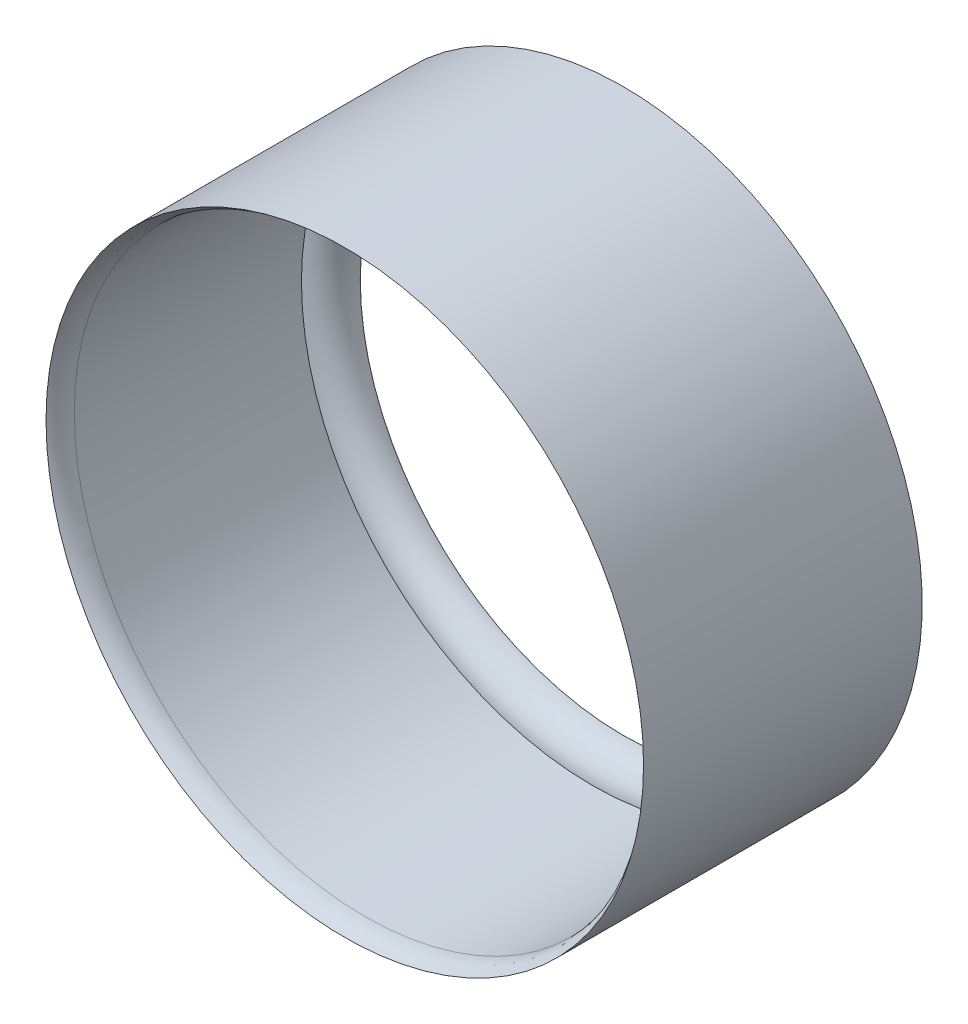
ISO-10303-21;
HEADER;
FILE_DESCRIPTION(('STEP AP214'),'2;1');
FILE_NAME('part.step','',(''),(''),'','','');
FILE_SCHEMA(('AUTOMOTIVE_DESIGN { 1 0 10303 214 1 1 1 1 }'));
ENDSEC;
DATA;
#1=APPLICATION_CONTEXT('core data for automotive mechanical design processes');
#2=APPLICATION_PROTOCOL_DEFINITION('international standard','automotive_design',2000,#1);
#3=PRODUCT_CONTEXT('',#1,'mechanical');
#4=PRODUCT('Part','Part','',(#3));
#5=PRODUCT_RELATED_PRODUCT_CATEGORY('part','',(#4));
#6=PRODUCT_DEFINITION_FORMATION('','',#4);
#7=PRODUCT_DEFINITION_CONTEXT('part definition',#1,'design');
#8=PRODUCT_DEFINITION('design','',#6,#7);
#9=PRODUCT_DEFINITION_SHAPE('','',#8);
#10=(LENGTH_UNIT() NAMED_UNIT(*) SI_UNIT(.MILLI.,.METRE.));
#11=(NAMED_UNIT(*) PLANE_ANGLE_UNIT() SI_UNIT($,.RADIAN.));
#12=(NAMED_UNIT(*) SI_UNIT($,.STERADIAN.) SOLID_ANGLE_UNIT());
#13=UNCERTAINTY_MEASURE_WITH_UNIT(LENGTH_MEASURE(1.E-05),#10,'distance_accuracy_value','');
#14=(GEOMETRIC_REPRESENTATION_CONTEXT(3) GLOBAL_UNCERTAINTY_ASSIGNED_CONTEXT((#13)) GLOBAL_UNIT_ASSIGNED_CONTEXT((#10,
#11,#12)) REPRESENTATION_CONTEXT('',''));
#15=CARTESIAN_POINT('',(0.,0.,0.));
#16=DIRECTION('',(0.,0.,1.));
#17=DIRECTION('',(1.,0.,0.));
#18=AXIS2_PLACEMENT_3D('',#15,#16,#17);
#19=CARTESIAN_POINT('',(0.,0.,400.));
#20=DIRECTION('',(0.,0.,-1.));
#21=DIRECTION('',(-1.,0.,0.));
#22=AXIS2_PLACEMENT_3D('',#19,#20,#21);
#23=CYLINDRICAL_SURFACE('',#22,482.5);
#24=CARTESIAN_POINT('',(0.,0.,400.));
#25=DIRECTION('',(0.,0.,1.));
#26=DIRECTION('',(1.,0.,0.));
#27=AXIS2_PLACEMENT_3D('',#24,#25,#26);
#28=CIRCLE('',#27,482.5);
#29=CARTESIAN_POINT('',(482.5,0.,400.));
#30=VERTEX_POINT('',#29);
#31=EDGE_CURVE('E56',#30,#30,#28,.T.);
#32=ORIENTED_EDGE('',*,*,#31,.F.);
#33=EDGE_LOOP('',(#32));
#34=FACE_BOUND('',#33,.T.);
#35=CARTESIAN_POINT('',(0.,0.,-50.));
#36=DIRECTION('',(0.,0.,-1.));
#37=DIRECTION('',(-1.,0.,0.));
#38=AXIS2_PLACEMENT_3D('',#35,#36,#37);
#39=CIRCLE('',#38,482.5);
#40=CARTESIAN_POINT('',(-482.5,0.,-50.));
#41=VERTEX_POINT('',#40);
#42=EDGE_CURVE('E67',#41,#41,#39,.T.);
#43=ORIENTED_EDGE('',*,*,#42,.F.);
#44=EDGE_LOOP('',(#43));
#45=FACE_BOUND('',#44,.T.);
#46=ADVANCED_FACE('F43',(#34,#45),#23,.T.);
#47=CARTESIAN_POINT('',(0.,0.,400.));
#48=DIRECTION('',(0.,0.,-1.));
#49=DIRECTION('',(-1.,0.,0.));
#50=AXIS2_PLACEMENT_3D('',#47,#48,#49);
#51=CYLINDRICAL_SURFACE('',#50,470.);
#52=CARTESIAN_POINT('',(0.,0.,366.928108611693));
#53=DIRECTION('',(0.,0.,1.));
#54=DIRECTION('',(1.,0.,0.));
#55=AXIS2_PLACEMENT_3D('',#52,#53,#54);
#56=CIRCLE('',#55,470.);
#57=CARTESIAN_POINT('',(470.,0.,366.928108611693));
#58=VERTEX_POINT('',#57);
#59=EDGE_CURVE('E51',#58,#58,#56,.T.);
#60=ORIENTED_EDGE('',*,*,#59,.T.);
#61=EDGE_LOOP('',(#60));
#62=FACE_BOUND('',#61,.T.);
#63=CARTESIAN_POINT('',(0.,0.,0.));
#64=DIRECTION('',(0.,0.,1.));
#65=DIRECTION('',(1.,0.,0.));
#66=AXIS2_PLACEMENT_3D('',#63,#64,#65);
#67=CIRCLE('',#66,470.);
#68=CARTESIAN_POINT('',(470.,0.,0.));
#69=VERTEX_POINT('',#68);
#70=EDGE_CURVE('E61',#69,#69,#67,.T.);
#71=ORIENTED_EDGE('',*,*,#70,.F.);
#72=EDGE_LOOP('',(#71));
#73=FACE_BOUND('',#72,.T.);
#74=ADVANCED_FACE('F89',(#62,#73),#51,.F.);
#75=CARTESIAN_POINT('',(0.,0.,366.928108611693));
#76=DIRECTION('',(0.,0.,1.));
#77=DIRECTION('',(1.,0.,0.));
#78=AXIS2_PLACEMENT_3D('',#75,#76,#77);
#79=TOROIDAL_SURFACE('',#78,520.,50.);
#80=ORIENTED_EDGE('',*,*,#31,.T.);
#81=EDGE_LOOP('',(#80));
#82=FACE_BOUND('',#81,.T.);
#83=ORIENTED_EDGE('',*,*,#59,.F.);
#84=EDGE_LOOP('',(#83));
#85=FACE_BOUND('',#84,.T.);
#86=ADVANCED_FACE('F80',(#82,#85),#79,.T.);
#87=CARTESIAN_POINT('',(0.,0.,-50.));
#88=DIRECTION('',(0.,0.,-1.));
#89=DIRECTION('',(-1.,0.,0.));
#90=AXIS2_PLACEMENT_3D('',#87,#88,#89);
#91=PLANE('',#90);
#92=ORIENTED_EDGE('',*,*,#42,.T.);
#93=EDGE_LOOP('',(#92));
#94=FACE_BOUND('',#93,.T.);
#95=CARTESIAN_POINT('',(0.,0.,-50.));
#96=DIRECTION('',(0.,0.,-1.));
#97=DIRECTION('',(-1.,0.,0.));
#98=AXIS2_PLACEMENT_3D('',#95,#96,#97);
#99=CIRCLE('',#98,425.);
#100=CARTESIAN_POINT('',(-425.,0.,-50.));
#101=VERTEX_POINT('',#100);
#102=EDGE_CURVE('E71',#101,#101,#99,.T.);
#103=ORIENTED_EDGE('',*,*,#102,.F.);
#104=EDGE_LOOP('',(#103));
#105=FACE_BOUND('',#104,.T.);
#106=ADVANCED_FACE('F78',(#94,#105),#91,.T.);
#107=CARTESIAN_POINT('',(0.,0.,-50.));
#108=DIRECTION('',(0.,0.,1.));
#109=DIRECTION('',(1.,0.,0.));
#110=AXIS2_PLACEMENT_3D('',#107,#108,#109);
#111=CYLINDRICAL_SURFACE('',#110,425.);
#112=CARTESIAN_POINT('',(0.,0.,-49.749371855331));
#113=DIRECTION('',(0.,0.,1.));
#114=DIRECTION('',(1.,0.,0.));
#115=AXIS2_PLACEMENT_3D('',#112,#113,#114);
#116=CIRCLE('',#115,425.);
#117=CARTESIAN_POINT('',(425.,0.,-49.749371855331));
#118=VERTEX_POINT('',#117);
#119=EDGE_CURVE('E10',#118,#118,#116,.T.);
#120=ORIENTED_EDGE('',*,*,#119,.T.);
#121=EDGE_LOOP('',(#120));
#122=FACE_BOUND('',#121,.T.);
#123=ORIENTED_EDGE('',*,*,#102,.T.);
#124=EDGE_LOOP('',(#123));
#125=FACE_BOUND('',#124,.T.);
#126=ADVANCED_FACE('F76',(#122,#125),#111,.F.);
#127=CARTESIAN_POINT('',(0.,0.,-49.749371855331));
#128=DIRECTION('',(0.,0.,1.));
#129=DIRECTION('',(1.,0.,0.));
#130=AXIS2_PLACEMENT_3D('',#127,#128,#129);
#131=TOROIDAL_SURFACE('',#130,475.,50.);
#132=ORIENTED_EDGE('',*,*,#119,.F.);
#133=EDGE_LOOP('',(#132));
#134=FACE_BOUND('',#133,.T.);
#135=ORIENTED_EDGE('',*,*,#70,.T.);
#136=EDGE_LOOP('',(#135));
#137=FACE_BOUND('',#136,.T.);
#138=ADVANCED_FACE('F45',(#134,#137),#131,.T.);
#139=CLOSED_SHELL('',(#46,#74,#86,#106,#126,#138));
#140=MANIFOLD_SOLID_BREP('B2',#139);
#141=ADVANCED_BREP_SHAPE_REPRESENTATION('',(#18,#140),#14);
#142=SHAPE_DEFINITION_REPRESENTATION(#9,#141);
ENDSEC;
END-ISO-10303-21;
